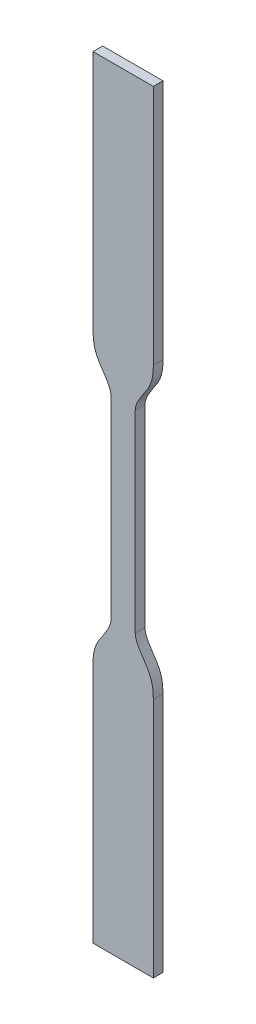
ISO-10303-21;
HEADER;
FILE_DESCRIPTION(('STEP AP214'),'2;1');
FILE_NAME('part.step','',(''),(''),'','','');
FILE_SCHEMA(('AUTOMOTIVE_DESIGN { 1 0 10303 214 1 1 1 1 }'));
ENDSEC;
DATA;
#1=APPLICATION_CONTEXT('core data for automotive mechanical design processes');
#2=APPLICATION_PROTOCOL_DEFINITION('international standard','automotive_design',2000,#1);
#3=PRODUCT_CONTEXT('',#1,'mechanical');
#4=PRODUCT('Part','Part','',(#3));
#5=PRODUCT_RELATED_PRODUCT_CATEGORY('part','',(#4));
#6=PRODUCT_DEFINITION_FORMATION('','',#4);
#7=PRODUCT_DEFINITION_CONTEXT('part definition',#1,'design');
#8=PRODUCT_DEFINITION('design','',#6,#7);
#9=PRODUCT_DEFINITION_SHAPE('','',#8);
#10=(LENGTH_UNIT() NAMED_UNIT(*) SI_UNIT(.MILLI.,.METRE.));
#11=(NAMED_UNIT(*) PLANE_ANGLE_UNIT() SI_UNIT($,.RADIAN.));
#12=(NAMED_UNIT(*) SI_UNIT($,.STERADIAN.) SOLID_ANGLE_UNIT());
#13=UNCERTAINTY_MEASURE_WITH_UNIT(LENGTH_MEASURE(1.E-05),#10,'distance_accuracy_value','');
#14=(GEOMETRIC_REPRESENTATION_CONTEXT(3) GLOBAL_UNCERTAINTY_ASSIGNED_CONTEXT((#13)) GLOBAL_UNIT_ASSIGNED_CONTEXT((#10,
#11,#12)) REPRESENTATION_CONTEXT('',''));
#15=CARTESIAN_POINT('',(0.,0.,0.));
#16=DIRECTION('',(0.,0.,1.));
#17=DIRECTION('',(1.,0.,0.));
#18=AXIS2_PLACEMENT_3D('',#15,#16,#17);
#19=CARTESIAN_POINT('',(-7.93749999999999,-101.6,2.54));
#20=DIRECTION('',(1.,0.,0.));
#21=DIRECTION('',(0.,1.,0.));
#22=AXIS2_PLACEMENT_3D('',#19,#20,#21);
#23=PLANE('',#22);
#24=DIRECTION('',(0.,-1.,0.));
#25=VECTOR('',#24,1.);
#26=CARTESIAN_POINT('',(-7.93749999999999,-101.6,0.));
#27=LINE('',#26,#25);
#28=CARTESIAN_POINT('',(-7.93749999999999,-38.1,0.));
#29=VERTEX_POINT('',#28);
#30=CARTESIAN_POINT('',(-7.93749999999999,-101.6,0.));
#31=VERTEX_POINT('',#30);
#32=EDGE_CURVE('E158',#29,#31,#27,.T.);
#33=ORIENTED_EDGE('',*,*,#32,.T.);
#34=DIRECTION('',(0.,0.,-1.));
#35=VECTOR('',#34,1.);
#36=CARTESIAN_POINT('',(-7.93749999999999,-101.6,2.54));
#37=LINE('',#36,#35);
#38=CARTESIAN_POINT('',(-7.93749999999999,-101.6,2.54));
#39=VERTEX_POINT('',#38);
#40=EDGE_CURVE('E11',#39,#31,#37,.T.);
#41=ORIENTED_EDGE('',*,*,#40,.F.);
#42=DIRECTION('',(0.,-1.,0.));
#43=VECTOR('',#42,1.);
#44=CARTESIAN_POINT('',(-7.93749999999999,-101.6,2.54));
#45=LINE('',#44,#43);
#46=CARTESIAN_POINT('',(-7.93749999999999,-38.1,2.54));
#47=VERTEX_POINT('',#46);
#48=EDGE_CURVE('E280',#47,#39,#45,.T.);
#49=ORIENTED_EDGE('',*,*,#48,.F.);
#50=DIRECTION('',(0.,0.,-1.));
#51=VECTOR('',#50,1.);
#52=CARTESIAN_POINT('',(-7.93749999999999,-38.1,2.54));
#53=LINE('',#52,#51);
#54=EDGE_CURVE('E148',#47,#29,#53,.T.);
#55=ORIENTED_EDGE('',*,*,#54,.T.);
#56=EDGE_LOOP('',(#33,#41,#49,#55));
#57=FACE_BOUND('',#56,.T.);
#58=ADVANCED_FACE('F32',(#57),#23,.F.);
#59=CARTESIAN_POINT('',(-7.93749999999999,-101.6,2.54));
#60=DIRECTION('',(0.,1.,0.));
#61=DIRECTION('',(0.,0.,1.));
#62=AXIS2_PLACEMENT_3D('',#59,#60,#61);
#63=PLANE('',#62);
#64=DIRECTION('',(1.,0.,0.));
#65=VECTOR('',#64,1.);
#66=CARTESIAN_POINT('',(-7.93749999999999,-101.6,0.));
#67=LINE('',#66,#65);
#68=CARTESIAN_POINT('',(7.93750000000001,-101.6,0.));
#69=VERTEX_POINT('',#68);
#70=EDGE_CURVE('E246',#31,#69,#67,.T.);
#71=ORIENTED_EDGE('',*,*,#70,.T.);
#72=DIRECTION('',(0.,0.,-1.));
#73=VECTOR('',#72,1.);
#74=CARTESIAN_POINT('',(7.93750000000001,-101.6,2.54));
#75=LINE('',#74,#73);
#76=CARTESIAN_POINT('',(7.93750000000001,-101.6,2.54));
#77=VERTEX_POINT('',#76);
#78=EDGE_CURVE('E40',#77,#69,#75,.T.);
#79=ORIENTED_EDGE('',*,*,#78,.F.);
#80=DIRECTION('',(1.,0.,0.));
#81=VECTOR('',#80,1.);
#82=CARTESIAN_POINT('',(-7.93749999999999,-101.6,2.54));
#83=LINE('',#82,#81);
#84=EDGE_CURVE('E103',#39,#77,#83,.T.);
#85=ORIENTED_EDGE('',*,*,#84,.F.);
#86=ORIENTED_EDGE('',*,*,#40,.T.);
#87=EDGE_LOOP('',(#71,#79,#85,#86));
#88=FACE_BOUND('',#87,.T.);
#89=ADVANCED_FACE('F303',(#88),#63,.F.);
#90=CARTESIAN_POINT('',(7.93750000000001,-101.6,2.54));
#91=DIRECTION('',(-1.,0.,0.));
#92=DIRECTION('',(0.,-1.,0.));
#93=AXIS2_PLACEMENT_3D('',#90,#91,#92);
#94=PLANE('',#93);
#95=DIRECTION('',(0.,1.,0.));
#96=VECTOR('',#95,1.);
#97=CARTESIAN_POINT('',(7.93750000000001,-101.6,0.));
#98=LINE('',#97,#96);
#99=CARTESIAN_POINT('',(7.93749999999999,-38.1,0.));
#100=VERTEX_POINT('',#99);
#101=EDGE_CURVE('E241',#69,#100,#98,.T.);
#102=ORIENTED_EDGE('',*,*,#101,.T.);
#103=DIRECTION('',(0.,0.,-1.));
#104=VECTOR('',#103,1.);
#105=CARTESIAN_POINT('',(7.93749999999999,-38.1,2.54));
#106=LINE('',#105,#104);
#107=CARTESIAN_POINT('',(7.93749999999999,-38.1,2.54));
#108=VERTEX_POINT('',#107);
#109=EDGE_CURVE('E233',#108,#100,#106,.T.);
#110=ORIENTED_EDGE('',*,*,#109,.F.);
#111=DIRECTION('',(0.,1.,0.));
#112=VECTOR('',#111,1.);
#113=CARTESIAN_POINT('',(7.93750000000001,-101.6,2.54));
#114=LINE('',#113,#112);
#115=EDGE_CURVE('E242',#77,#108,#114,.T.);
#116=ORIENTED_EDGE('',*,*,#115,.F.);
#117=ORIENTED_EDGE('',*,*,#78,.T.);
#118=EDGE_LOOP('',(#102,#110,#116,#117));
#119=FACE_BOUND('',#118,.T.);
#120=ADVANCED_FACE('F239',(#119),#94,.F.);
#121=CARTESIAN_POINT('',(7.93749999999999,-38.1,2.54));
#122=CARTESIAN_POINT('',(7.93749999999999,-35.4194143260671,2.54));
#123=CARTESIAN_POINT('',(7.08508997037496,-31.8966643503183,2.54));
#124=CARTESIAN_POINT('',(3.25287706765266,-27.6398760800054,2.54));
#125=CARTESIAN_POINT('',(3.175,-25.4,2.54));
#126=B_SPLINE_CURVE_WITH_KNOTS('',3,(#121,#122,#123,#124,#125),.UNSPECIFIED.,.F.,.F.,(4,1,4),
(0.,0.475835686612869,1.),.UNSPECIFIED.);
#127=DIRECTION('',(0.,0.,-1.));
#128=VECTOR('',#127,1.);
#129=SURFACE_OF_LINEAR_EXTRUSION('',#126,#128);
#130=CARTESIAN_POINT('',(7.93749999999999,-38.1,0.));
#131=CARTESIAN_POINT('',(7.93749999999999,-35.4194143260671,0.));
#132=CARTESIAN_POINT('',(7.08508997037496,-31.8966643503183,0.));
#133=CARTESIAN_POINT('',(3.25287706765266,-27.6398760800054,0.));
#134=CARTESIAN_POINT('',(3.175,-25.4,0.));
#135=B_SPLINE_CURVE_WITH_KNOTS('',3,(#130,#131,#132,#133,#134),.UNSPECIFIED.,.F.,.F.,(4,1,4),
(0.,0.475835686612869,1.),.UNSPECIFIED.);
#136=CARTESIAN_POINT('',(3.175,-25.4,0.));
#137=VERTEX_POINT('',#136);
#138=EDGE_CURVE('E248',#100,#137,#135,.T.);
#139=ORIENTED_EDGE('',*,*,#138,.T.);
#140=DIRECTION('',(0.,0.,-1.));
#141=VECTOR('',#140,1.);
#142=CARTESIAN_POINT('',(3.175,-25.4,2.54));
#143=LINE('',#142,#141);
#144=CARTESIAN_POINT('',(3.175,-25.4,2.54));
#145=VERTEX_POINT('',#144);
#146=EDGE_CURVE('E230',#145,#137,#143,.T.);
#147=ORIENTED_EDGE('',*,*,#146,.F.);
#148=EDGE_CURVE('E291',#108,#145,#126,.T.);
#149=ORIENTED_EDGE('',*,*,#148,.F.);
#150=ORIENTED_EDGE('',*,*,#109,.T.);
#151=EDGE_LOOP('',(#139,#147,#149,#150));
#152=FACE_BOUND('',#151,.T.);
#153=ADVANCED_FACE('F298',(#152),#129,.F.);
#154=CARTESIAN_POINT('',(3.175,-25.4,2.54));
#155=DIRECTION('',(-1.,0.,0.));
#156=DIRECTION('',(0.,0.,1.));
#157=AXIS2_PLACEMENT_3D('',#154,#155,#156);
#158=PLANE('',#157);
#159=DIRECTION('',(0.,1.,0.));
#160=VECTOR('',#159,1.);
#161=CARTESIAN_POINT('',(3.175,-25.4,0.));
#162=LINE('',#161,#160);
#163=CARTESIAN_POINT('',(3.175,25.4,0.));
#164=VERTEX_POINT('',#163);
#165=EDGE_CURVE('E250',#137,#164,#162,.T.);
#166=ORIENTED_EDGE('',*,*,#165,.T.);
#167=DIRECTION('',(0.,0.,-1.));
#168=VECTOR('',#167,1.);
#169=CARTESIAN_POINT('',(3.175,25.4,2.54));
#170=LINE('',#169,#168);
#171=CARTESIAN_POINT('',(3.175,25.4,2.54));
#172=VERTEX_POINT('',#171);
#173=EDGE_CURVE('E227',#172,#164,#170,.T.);
#174=ORIENTED_EDGE('',*,*,#173,.F.);
#175=DIRECTION('',(0.,1.,0.));
#176=VECTOR('',#175,1.);
#177=CARTESIAN_POINT('',(3.175,-25.4,2.54));
#178=LINE('',#177,#176);
#179=EDGE_CURVE('E200',#145,#172,#178,.T.);
#180=ORIENTED_EDGE('',*,*,#179,.F.);
#181=ORIENTED_EDGE('',*,*,#146,.T.);
#182=EDGE_LOOP('',(#166,#174,#180,#181));
#183=FACE_BOUND('',#182,.T.);
#184=ADVANCED_FACE('F190',(#183),#158,.F.);
#185=CARTESIAN_POINT('',(3.175,25.4,2.54));
#186=CARTESIAN_POINT('',(3.25287706765266,27.6398760800054,2.54));
#187=CARTESIAN_POINT('',(7.08508997037496,31.8966643503183,2.54));
#188=CARTESIAN_POINT('',(7.93749999999999,35.4194143260671,2.54));
#189=CARTESIAN_POINT('',(7.93749999999999,38.1,2.54));
#190=B_SPLINE_CURVE_WITH_KNOTS('',3,(#185,#186,#187,#188,#189),.UNSPECIFIED.,.F.,.F.,(4,1,4),
(0.,0.524164313387131,1.),.UNSPECIFIED.);
#191=DIRECTION('',(0.,0.,-1.));
#192=VECTOR('',#191,1.);
#193=SURFACE_OF_LINEAR_EXTRUSION('',#190,#192);
#194=CARTESIAN_POINT('',(3.175,25.4,0.));
#195=CARTESIAN_POINT('',(3.25287706765266,27.6398760800054,0.));
#196=CARTESIAN_POINT('',(7.08508997037496,31.8966643503183,0.));
#197=CARTESIAN_POINT('',(7.93749999999999,35.4194143260671,0.));
#198=CARTESIAN_POINT('',(7.93749999999999,38.1,0.));
#199=B_SPLINE_CURVE_WITH_KNOTS('',3,(#194,#195,#196,#197,#198),.UNSPECIFIED.,.F.,.F.,(4,1,4),
(0.,0.524164313387131,1.),.UNSPECIFIED.);
#200=CARTESIAN_POINT('',(7.93749999999999,38.1,0.));
#201=VERTEX_POINT('',#200);
#202=EDGE_CURVE('E259',#164,#201,#199,.T.);
#203=ORIENTED_EDGE('',*,*,#202,.T.);
#204=DIRECTION('',(0.,0.,-1.));
#205=VECTOR('',#204,1.);
#206=CARTESIAN_POINT('',(7.93749999999999,38.1,2.54));
#207=LINE('',#206,#205);
#208=CARTESIAN_POINT('',(7.93749999999999,38.1,2.54));
#209=VERTEX_POINT('',#208);
#210=EDGE_CURVE('E224',#209,#201,#207,.T.);
#211=ORIENTED_EDGE('',*,*,#210,.F.);
#212=EDGE_CURVE('E193',#172,#209,#190,.T.);
#213=ORIENTED_EDGE('',*,*,#212,.F.);
#214=ORIENTED_EDGE('',*,*,#173,.T.);
#215=EDGE_LOOP('',(#203,#211,#213,#214));
#216=FACE_BOUND('',#215,.T.);
#217=ADVANCED_FACE('F185',(#216),#193,.F.);
#218=CARTESIAN_POINT('',(7.93750000000001,101.6,2.54));
#219=DIRECTION('',(-1.,0.,0.));
#220=DIRECTION('',(0.,-1.,0.));
#221=AXIS2_PLACEMENT_3D('',#218,#219,#220);
#222=PLANE('',#221);
#223=DIRECTION('',(0.,1.,0.));
#224=VECTOR('',#223,1.);
#225=CARTESIAN_POINT('',(7.93750000000001,101.6,0.));
#226=LINE('',#225,#224);
#227=CARTESIAN_POINT('',(7.93750000000001,101.6,0.));
#228=VERTEX_POINT('',#227);
#229=EDGE_CURVE('E263',#201,#228,#226,.T.);
#230=ORIENTED_EDGE('',*,*,#229,.T.);
#231=DIRECTION('',(0.,0.,-1.));
#232=VECTOR('',#231,1.);
#233=CARTESIAN_POINT('',(7.93750000000001,101.6,2.54));
#234=LINE('',#233,#232);
#235=CARTESIAN_POINT('',(7.93750000000001,101.6,2.54));
#236=VERTEX_POINT('',#235);
#237=EDGE_CURVE('E217',#236,#228,#234,.T.);
#238=ORIENTED_EDGE('',*,*,#237,.F.);
#239=DIRECTION('',(0.,1.,0.));
#240=VECTOR('',#239,1.);
#241=CARTESIAN_POINT('',(7.93750000000001,101.6,2.54));
#242=LINE('',#241,#240);
#243=EDGE_CURVE('E199',#209,#236,#242,.T.);
#244=ORIENTED_EDGE('',*,*,#243,.F.);
#245=ORIENTED_EDGE('',*,*,#210,.T.);
#246=EDGE_LOOP('',(#230,#238,#244,#245));
#247=FACE_BOUND('',#246,.T.);
#248=ADVANCED_FACE('F181',(#247),#222,.F.);
#249=CARTESIAN_POINT('',(-7.93749999999999,101.6,2.54));
#250=DIRECTION('',(0.,-1.,0.));
#251=DIRECTION('',(0.,0.,-1.));
#252=AXIS2_PLACEMENT_3D('',#249,#250,#251);
#253=PLANE('',#252);
#254=DIRECTION('',(-1.,0.,0.));
#255=VECTOR('',#254,1.);
#256=CARTESIAN_POINT('',(-7.93749999999999,101.6,0.));
#257=LINE('',#256,#255);
#258=CARTESIAN_POINT('',(-7.93749999999999,101.6,0.));
#259=VERTEX_POINT('',#258);
#260=EDGE_CURVE('E215',#228,#259,#257,.T.);
#261=ORIENTED_EDGE('',*,*,#260,.T.);
#262=DIRECTION('',(0.,0.,-1.));
#263=VECTOR('',#262,1.);
#264=CARTESIAN_POINT('',(-7.93749999999999,101.6,2.54));
#265=LINE('',#264,#263);
#266=CARTESIAN_POINT('',(-7.93749999999999,101.6,2.54));
#267=VERTEX_POINT('',#266);
#268=EDGE_CURVE('E213',#267,#259,#265,.T.);
#269=ORIENTED_EDGE('',*,*,#268,.F.);
#270=DIRECTION('',(-1.,0.,0.));
#271=VECTOR('',#270,1.);
#272=CARTESIAN_POINT('',(-7.93749999999999,101.6,2.54));
#273=LINE('',#272,#271);
#274=EDGE_CURVE('E206',#236,#267,#273,.T.);
#275=ORIENTED_EDGE('',*,*,#274,.F.);
#276=ORIENTED_EDGE('',*,*,#237,.T.);
#277=EDGE_LOOP('',(#261,#269,#275,#276));
#278=FACE_BOUND('',#277,.T.);
#279=ADVANCED_FACE('F177',(#278),#253,.F.);
#280=CARTESIAN_POINT('',(-7.93749999999999,101.6,2.54));
#281=DIRECTION('',(1.,0.,0.));
#282=DIRECTION('',(0.,1.,0.));
#283=AXIS2_PLACEMENT_3D('',#280,#281,#282);
#284=PLANE('',#283);
#285=DIRECTION('',(0.,-1.,0.));
#286=VECTOR('',#285,1.);
#287=CARTESIAN_POINT('',(-7.93749999999999,101.6,0.));
#288=LINE('',#287,#286);
#289=CARTESIAN_POINT('',(-7.93749999999999,38.1,0.));
#290=VERTEX_POINT('',#289);
#291=EDGE_CURVE('E219',#259,#290,#288,.T.);
#292=ORIENTED_EDGE('',*,*,#291,.T.);
#293=DIRECTION('',(0.,0.,-1.));
#294=VECTOR('',#293,1.);
#295=CARTESIAN_POINT('',(-7.93749999999999,38.1,2.54));
#296=LINE('',#295,#294);
#297=CARTESIAN_POINT('',(-7.93749999999999,38.1,2.54));
#298=VERTEX_POINT('',#297);
#299=EDGE_CURVE('E143',#298,#290,#296,.T.);
#300=ORIENTED_EDGE('',*,*,#299,.F.);
#301=DIRECTION('',(0.,-1.,0.));
#302=VECTOR('',#301,1.);
#303=CARTESIAN_POINT('',(-7.93749999999999,101.6,2.54));
#304=LINE('',#303,#302);
#305=EDGE_CURVE('E134',#267,#298,#304,.T.);
#306=ORIENTED_EDGE('',*,*,#305,.F.);
#307=ORIENTED_EDGE('',*,*,#268,.T.);
#308=EDGE_LOOP('',(#292,#300,#306,#307));
#309=FACE_BOUND('',#308,.T.);
#310=ADVANCED_FACE('F174',(#309),#284,.F.);
#311=CARTESIAN_POINT('',(-7.93749999999999,38.1,2.54));
#312=CARTESIAN_POINT('',(-7.93749999999999,35.4194143260671,2.54));
#313=CARTESIAN_POINT('',(-7.08508997037496,31.8966643503183,2.54));
#314=CARTESIAN_POINT('',(-3.25287706765267,27.6398760800054,2.54));
#315=CARTESIAN_POINT('',(-3.175,25.4,2.54));
#316=B_SPLINE_CURVE_WITH_KNOTS('',3,(#311,#312,#313,#314,#315),.UNSPECIFIED.,.F.,.F.,(4,1,4),
(0.,0.475835686612869,1.),.UNSPECIFIED.);
#317=DIRECTION('',(0.,0.,-1.));
#318=VECTOR('',#317,1.);
#319=SURFACE_OF_LINEAR_EXTRUSION('',#316,#318);
#320=CARTESIAN_POINT('',(-7.93749999999999,38.1,0.));
#321=CARTESIAN_POINT('',(-7.93749999999999,35.4194143260671,0.));
#322=CARTESIAN_POINT('',(-7.08508997037496,31.8966643503183,0.));
#323=CARTESIAN_POINT('',(-3.25287706765267,27.6398760800054,0.));
#324=CARTESIAN_POINT('',(-3.175,25.4,0.));
#325=B_SPLINE_CURVE_WITH_KNOTS('',3,(#320,#321,#322,#323,#324),.UNSPECIFIED.,.F.,.F.,(4,1,4),
(0.,0.475835686612869,1.),.UNSPECIFIED.);
#326=CARTESIAN_POINT('',(-3.175,25.4,0.));
#327=VERTEX_POINT('',#326);
#328=EDGE_CURVE('E142',#290,#327,#325,.T.);
#329=ORIENTED_EDGE('',*,*,#328,.T.);
#330=DIRECTION('',(0.,0.,-1.));
#331=VECTOR('',#330,1.);
#332=CARTESIAN_POINT('',(-3.175,25.4,2.54));
#333=LINE('',#332,#331);
#334=CARTESIAN_POINT('',(-3.175,25.4,2.54));
#335=VERTEX_POINT('',#334);
#336=EDGE_CURVE('E139',#335,#327,#333,.T.);
#337=ORIENTED_EDGE('',*,*,#336,.F.);
#338=EDGE_CURVE('E128',#298,#335,#316,.T.);
#339=ORIENTED_EDGE('',*,*,#338,.F.);
#340=ORIENTED_EDGE('',*,*,#299,.T.);
#341=EDGE_LOOP('',(#329,#337,#339,#340));
#342=FACE_BOUND('',#341,.T.);
#343=ADVANCED_FACE('F140',(#342),#319,.F.);
#344=CARTESIAN_POINT('',(-3.175,-25.4,2.54));
#345=DIRECTION('',(1.,0.,0.));
#346=DIRECTION('',(0.,0.,-1.));
#347=AXIS2_PLACEMENT_3D('',#344,#345,#346);
#348=PLANE('',#347);
#349=DIRECTION('',(0.,-1.,0.));
#350=VECTOR('',#349,1.);
#351=CARTESIAN_POINT('',(-3.175,-25.4,0.));
#352=LINE('',#351,#350);
#353=CARTESIAN_POINT('',(-3.175,-25.4,0.));
#354=VERTEX_POINT('',#353);
#355=EDGE_CURVE('E89',#327,#354,#352,.T.);
#356=ORIENTED_EDGE('',*,*,#355,.T.);
#357=DIRECTION('',(0.,0.,-1.));
#358=VECTOR('',#357,1.);
#359=CARTESIAN_POINT('',(-3.175,-25.4,2.54));
#360=LINE('',#359,#358);
#361=CARTESIAN_POINT('',(-3.175,-25.4,2.54));
#362=VERTEX_POINT('',#361);
#363=EDGE_CURVE('E144',#362,#354,#360,.T.);
#364=ORIENTED_EDGE('',*,*,#363,.F.);
#365=DIRECTION('',(0.,-1.,0.));
#366=VECTOR('',#365,1.);
#367=CARTESIAN_POINT('',(-3.175,-25.4,2.54));
#368=LINE('',#367,#366);
#369=EDGE_CURVE('E132',#335,#362,#368,.T.);
#370=ORIENTED_EDGE('',*,*,#369,.F.);
#371=ORIENTED_EDGE('',*,*,#336,.T.);
#372=EDGE_LOOP('',(#356,#364,#370,#371));
#373=FACE_BOUND('',#372,.T.);
#374=ADVANCED_FACE('F146',(#373),#348,.F.);
#375=CARTESIAN_POINT('',(-3.17499999999999,-25.4,2.54));
#376=CARTESIAN_POINT('',(-3.25287706765266,-27.6398760800054,2.54));
#377=CARTESIAN_POINT('',(-7.08508997037496,-31.8966643503183,2.54));
#378=CARTESIAN_POINT('',(-7.9375,-35.4194143260671,2.54));
#379=CARTESIAN_POINT('',(-7.93749999999999,-38.1,2.54));
#380=B_SPLINE_CURVE_WITH_KNOTS('',3,(#375,#376,#377,#378,#379),.UNSPECIFIED.,.F.,.F.,(4,1,4),
(0.,0.524164313387131,1.),.UNSPECIFIED.);
#381=DIRECTION('',(0.,0.,-1.));
#382=VECTOR('',#381,1.);
#383=SURFACE_OF_LINEAR_EXTRUSION('',#380,#382);
#384=CARTESIAN_POINT('',(-3.17499999999999,-25.4,0.));
#385=CARTESIAN_POINT('',(-3.25287706765266,-27.6398760800054,0.));
#386=CARTESIAN_POINT('',(-7.08508997037496,-31.8966643503183,0.));
#387=CARTESIAN_POINT('',(-7.9375,-35.4194143260671,0.));
#388=CARTESIAN_POINT('',(-7.93749999999999,-38.1,0.));
#389=B_SPLINE_CURVE_WITH_KNOTS('',3,(#384,#385,#386,#387,#388),.UNSPECIFIED.,.F.,.F.,(4,1,4),
(0.,0.524164313387131,1.),.UNSPECIFIED.);
#390=EDGE_CURVE('E95',#354,#29,#389,.T.);
#391=ORIENTED_EDGE('',*,*,#390,.T.);
#392=ORIENTED_EDGE('',*,*,#54,.F.);
#393=EDGE_CURVE('E48',#362,#47,#380,.T.);
#394=ORIENTED_EDGE('',*,*,#393,.F.);
#395=ORIENTED_EDGE('',*,*,#363,.T.);
#396=EDGE_LOOP('',(#391,#392,#394,#395));
#397=FACE_BOUND('',#396,.T.);
#398=ADVANCED_FACE('F164',(#397),#383,.F.);
#399=CARTESIAN_POINT('',(-6.2820683435944,-31.6187514762438,2.54));
#400=DIRECTION('',(0.,0.,1.));
#401=DIRECTION('',(1.,0.,0.));
#402=AXIS2_PLACEMENT_3D('',#399,#400,#401);
#403=PLANE('',#402);
#404=ORIENTED_EDGE('',*,*,#48,.T.);
#405=ORIENTED_EDGE('',*,*,#84,.T.);
#406=ORIENTED_EDGE('',*,*,#115,.T.);
#407=ORIENTED_EDGE('',*,*,#148,.T.);
#408=ORIENTED_EDGE('',*,*,#179,.T.);
#409=ORIENTED_EDGE('',*,*,#212,.T.);
#410=ORIENTED_EDGE('',*,*,#243,.T.);
#411=ORIENTED_EDGE('',*,*,#274,.T.);
#412=ORIENTED_EDGE('',*,*,#305,.T.);
#413=ORIENTED_EDGE('',*,*,#338,.T.);
#414=ORIENTED_EDGE('',*,*,#369,.T.);
#415=ORIENTED_EDGE('',*,*,#393,.T.);
#416=EDGE_LOOP('',(#404,#405,#406,#407,#408,#409,#410,#411,#412,#413,#414,#415));
#417=FACE_BOUND('',#416,.T.);
#418=ADVANCED_FACE('F130',(#417),#403,.T.);
#419=CARTESIAN_POINT('',(-6.2820683435944,-31.6187514762438,0.));
#420=DIRECTION('',(0.,0.,1.));
#421=DIRECTION('',(1.,0.,0.));
#422=AXIS2_PLACEMENT_3D('',#419,#420,#421);
#423=PLANE('',#422);
#424=ORIENTED_EDGE('',*,*,#32,.F.);
#425=ORIENTED_EDGE('',*,*,#390,.F.);
#426=ORIENTED_EDGE('',*,*,#355,.F.);
#427=ORIENTED_EDGE('',*,*,#328,.F.);
#428=ORIENTED_EDGE('',*,*,#291,.F.);
#429=ORIENTED_EDGE('',*,*,#260,.F.);
#430=ORIENTED_EDGE('',*,*,#229,.F.);
#431=ORIENTED_EDGE('',*,*,#202,.F.);
#432=ORIENTED_EDGE('',*,*,#165,.F.);
#433=ORIENTED_EDGE('',*,*,#138,.F.);
#434=ORIENTED_EDGE('',*,*,#101,.F.);
#435=ORIENTED_EDGE('',*,*,#70,.F.);
#436=EDGE_LOOP('',(#424,#425,#426,#427,#428,#429,#430,#431,#432,#433,#434,#435));
#437=FACE_BOUND('',#436,.T.);
#438=ADVANCED_FACE('F168',(#437),#423,.F.);
#439=CLOSED_SHELL('',(#58,#89,#120,#153,#184,#217,#248,#279,#310,#343,#374,#398,#418,#438));
#440=MANIFOLD_SOLID_BREP('B2',#439);
#441=ADVANCED_BREP_SHAPE_REPRESENTATION('',(#18,#440),#14);
#442=SHAPE_DEFINITION_REPRESENTATION(#9,#441);
ENDSEC;
END-ISO-10303-21;
